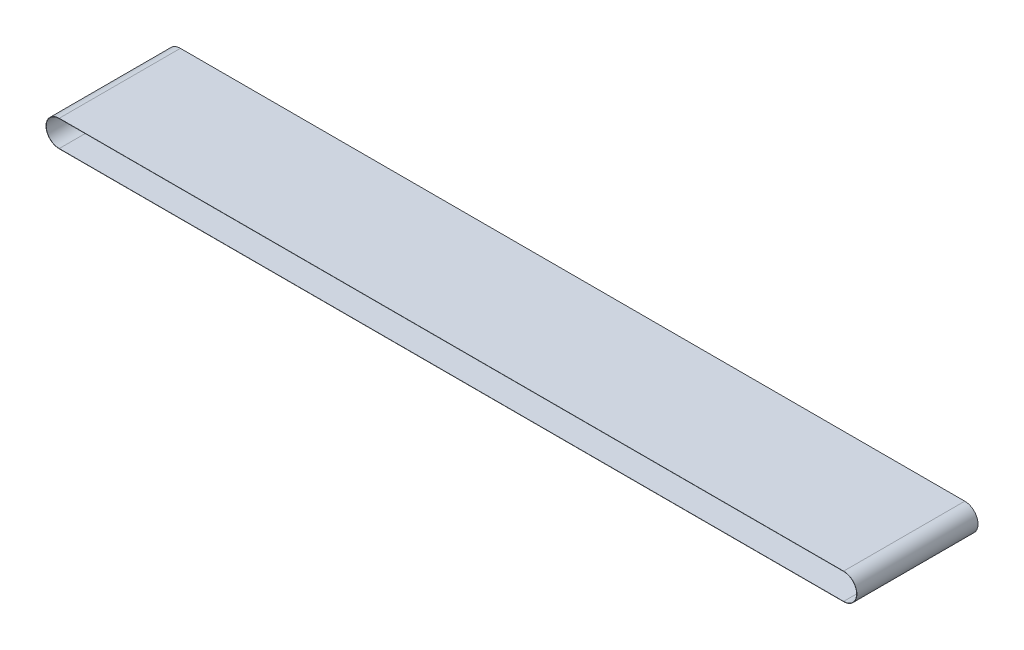
ISO-10303-21;
HEADER;
FILE_DESCRIPTION(('STEP AP214'),'2;1');
FILE_NAME('part.step','',(''),(''),'','','');
FILE_SCHEMA(('AUTOMOTIVE_DESIGN { 1 0 10303 214 1 1 1 1 }'));
ENDSEC;
DATA;
#1=APPLICATION_CONTEXT('core data for automotive mechanical design processes');
#2=APPLICATION_PROTOCOL_DEFINITION('international standard','automotive_design',2000,#1);
#3=PRODUCT_CONTEXT('',#1,'mechanical');
#4=PRODUCT('Part','Part','',(#3));
#5=PRODUCT_RELATED_PRODUCT_CATEGORY('part','',(#4));
#6=PRODUCT_DEFINITION_FORMATION('','',#4);
#7=PRODUCT_DEFINITION_CONTEXT('part definition',#1,'design');
#8=PRODUCT_DEFINITION('design','',#6,#7);
#9=PRODUCT_DEFINITION_SHAPE('','',#8);
#10=(LENGTH_UNIT() NAMED_UNIT(*) SI_UNIT(.MILLI.,.METRE.));
#11=(NAMED_UNIT(*) PLANE_ANGLE_UNIT() SI_UNIT($,.RADIAN.));
#12=(NAMED_UNIT(*) SI_UNIT($,.STERADIAN.) SOLID_ANGLE_UNIT());
#13=UNCERTAINTY_MEASURE_WITH_UNIT(LENGTH_MEASURE(1.E-05),#10,'distance_accuracy_value','');
#14=(GEOMETRIC_REPRESENTATION_CONTEXT(3) GLOBAL_UNCERTAINTY_ASSIGNED_CONTEXT((#13)) GLOBAL_UNIT_ASSIGNED_CONTEXT((#10,
#11,#12)) REPRESENTATION_CONTEXT('',''));
#15=CARTESIAN_POINT('',(0.,0.,0.));
#16=DIRECTION('',(0.,0.,1.));
#17=DIRECTION('',(1.,0.,0.));
#18=AXIS2_PLACEMENT_3D('',#15,#16,#17);
#19=CARTESIAN_POINT('',(-9873.27611144198,166.499999999996,762.5));
#20=DIRECTION('',(0.,1.,0.));
#21=DIRECTION('',(-1.,0.,0.));
#22=AXIS2_PLACEMENT_3D('',#19,#20,#21);
#23=PLANE('',#22);
#24=DIRECTION('',(1.,0.,0.));
#25=VECTOR('',#24,1.);
#26=CARTESIAN_POINT('',(-9873.27611144198,166.499999999997,-762.5));
#27=LINE('',#26,#25);
#28=CARTESIAN_POINT('',(-9873.27611144198,166.499999999997,-762.5));
#29=VERTEX_POINT('',#28);
#30=CARTESIAN_POINT('',(0.,166.499999999999,-762.5));
#31=VERTEX_POINT('',#30);
#32=EDGE_CURVE('E11',#29,#31,#27,.T.);
#33=ORIENTED_EDGE('',*,*,#32,.F.);
#34=DIRECTION('',(0.,0.,1.));
#35=VECTOR('',#34,1.);
#36=CARTESIAN_POINT('',(-9873.27611144198,166.499999999996,762.5));
#37=LINE('',#36,#35);
#38=CARTESIAN_POINT('',(-9873.27611144198,166.499999999996,762.5));
#39=VERTEX_POINT('',#38);
#40=EDGE_CURVE('E37',#29,#39,#37,.T.);
#41=ORIENTED_EDGE('',*,*,#40,.T.);
#42=DIRECTION('',(1.,0.,0.));
#43=VECTOR('',#42,1.);
#44=CARTESIAN_POINT('',(-9873.27611144198,166.499999999996,762.5));
#45=LINE('',#44,#43);
#46=CARTESIAN_POINT('',(0.,166.499999999999,762.5));
#47=VERTEX_POINT('',#46);
#48=EDGE_CURVE('E122',#39,#47,#45,.T.);
#49=ORIENTED_EDGE('',*,*,#48,.T.);
#50=DIRECTION('',(0.,0.,1.));
#51=VECTOR('',#50,1.);
#52=CARTESIAN_POINT('',(0.,166.499999999999,762.5));
#53=LINE('',#52,#51);
#54=EDGE_CURVE('E125',#31,#47,#53,.T.);
#55=ORIENTED_EDGE('',*,*,#54,.F.);
#56=EDGE_LOOP('',(#33,#41,#49,#55));
#57=FACE_BOUND('',#56,.T.);
#58=ADVANCED_FACE('F34',(#57),#23,.T.);
#59=CARTESIAN_POINT('',(-9873.27611144198,166.499999999997,-762.5));
#60=DIRECTION('',(0.,0.,-1.));
#61=DIRECTION('',(-1.,0.,0.));
#62=AXIS2_PLACEMENT_3D('',#59,#60,#61);
#63=PLANE('',#62);
#64=DIRECTION('',(1.,0.,0.));
#65=VECTOR('',#64,1.);
#66=CARTESIAN_POINT('',(-9873.27611144198,163.499999999996,-762.5));
#67=LINE('',#66,#65);
#68=CARTESIAN_POINT('',(-9873.27611144198,163.499999999996,-762.5));
#69=VERTEX_POINT('',#68);
#70=CARTESIAN_POINT('',(0.,163.499999999999,-762.5));
#71=VERTEX_POINT('',#70);
#72=EDGE_CURVE('E42',#69,#71,#67,.T.);
#73=ORIENTED_EDGE('',*,*,#72,.F.);
#74=DIRECTION('',(0.,1.,0.));
#75=VECTOR('',#74,1.);
#76=CARTESIAN_POINT('',(-9873.27611144198,166.499999999997,-762.5));
#77=LINE('',#76,#75);
#78=EDGE_CURVE('E192',#69,#29,#77,.T.);
#79=ORIENTED_EDGE('',*,*,#78,.T.);
#80=ORIENTED_EDGE('',*,*,#32,.T.);
#81=DIRECTION('',(0.,1.,0.));
#82=VECTOR('',#81,1.);
#83=CARTESIAN_POINT('',(0.,166.499999999999,-762.5));
#84=LINE('',#83,#82);
#85=EDGE_CURVE('E150',#71,#31,#84,.T.);
#86=ORIENTED_EDGE('',*,*,#85,.F.);
#87=EDGE_LOOP('',(#73,#79,#80,#86));
#88=FACE_BOUND('',#87,.T.);
#89=ADVANCED_FACE('F216',(#88),#63,.T.);
#90=CARTESIAN_POINT('',(-9873.27611144198,163.499999999996,762.5));
#91=DIRECTION('',(0.,-1.,0.));
#92=DIRECTION('',(1.,0.,0.));
#93=AXIS2_PLACEMENT_3D('',#90,#91,#92);
#94=PLANE('',#93);
#95=DIRECTION('',(1.,0.,0.));
#96=VECTOR('',#95,1.);
#97=CARTESIAN_POINT('',(-9873.27611144198,163.499999999996,762.5));
#98=LINE('',#97,#96);
#99=CARTESIAN_POINT('',(-9873.27611144198,163.499999999996,762.5));
#100=VERTEX_POINT('',#99);
#101=CARTESIAN_POINT('',(0.,163.499999999999,762.5));
#102=VERTEX_POINT('',#101);
#103=EDGE_CURVE('E131',#100,#102,#98,.T.);
#104=ORIENTED_EDGE('',*,*,#103,.F.);
#105=DIRECTION('',(0.,0.,-1.));
#106=VECTOR('',#105,1.);
#107=CARTESIAN_POINT('',(-9873.27611144198,163.499999999996,762.5));
#108=LINE('',#107,#106);
#109=EDGE_CURVE('E176',#100,#69,#108,.T.);
#110=ORIENTED_EDGE('',*,*,#109,.T.);
#111=ORIENTED_EDGE('',*,*,#72,.T.);
#112=DIRECTION('',(0.,0.,-1.));
#113=VECTOR('',#112,1.);
#114=CARTESIAN_POINT('',(0.,163.499999999999,762.5));
#115=LINE('',#114,#113);
#116=EDGE_CURVE('E154',#102,#71,#115,.T.);
#117=ORIENTED_EDGE('',*,*,#116,.F.);
#118=EDGE_LOOP('',(#104,#110,#111,#117));
#119=FACE_BOUND('',#118,.T.);
#120=ADVANCED_FACE('F221',(#119),#94,.T.);
#121=CARTESIAN_POINT('',(-9873.27611144197,-8.88178419700125E-13,0.));
#122=DIRECTION('',(0.,0.,-1.));
#123=DIRECTION('',(-1.,0.,0.));
#124=AXIS2_PLACEMENT_3D('',#121,#122,#123);
#125=CYLINDRICAL_SURFACE('',#124,166.499999999997);
#126=ORIENTED_EDGE('',*,*,#40,.F.);
#127=CARTESIAN_POINT('',(-9873.27611144197,-8.88178419700125E-13,-762.5));
#128=DIRECTION('',(0.,0.,-1.));
#129=DIRECTION('',(0.,-1.,0.));
#130=AXIS2_PLACEMENT_3D('',#127,#128,#129);
#131=CIRCLE('',#130,166.499999999997);
#132=CARTESIAN_POINT('',(-9873.27611144197,-166.500000000002,-762.5));
#133=VERTEX_POINT('',#132);
#134=EDGE_CURVE('E78',#133,#29,#131,.T.);
#135=ORIENTED_EDGE('',*,*,#134,.F.);
#136=DIRECTION('',(0.,0.,1.));
#137=VECTOR('',#136,1.);
#138=CARTESIAN_POINT('',(-9873.27611144197,-166.499999999998,762.5));
#139=LINE('',#138,#137);
#140=CARTESIAN_POINT('',(-9873.27611144197,-166.500000000002,762.5));
#141=VERTEX_POINT('',#140);
#142=EDGE_CURVE('E179',#133,#141,#139,.T.);
#143=ORIENTED_EDGE('',*,*,#142,.T.);
#144=CARTESIAN_POINT('',(-9873.27611144197,-8.88178419700125E-13,762.5));
#145=DIRECTION('',(0.,0.,-1.));
#146=DIRECTION('',(0.,-1.,0.));
#147=AXIS2_PLACEMENT_3D('',#144,#145,#146);
#148=CIRCLE('',#147,166.499999999997);
#149=EDGE_CURVE('E174',#141,#39,#148,.T.);
#150=ORIENTED_EDGE('',*,*,#149,.T.);
#151=EDGE_LOOP('',(#126,#135,#143,#150));
#152=FACE_BOUND('',#151,.T.);
#153=ADVANCED_FACE('F205',(#152),#125,.T.);
#154=CARTESIAN_POINT('',(-9873.27611144197,-166.499999999998,-762.5));
#155=DIRECTION('',(0.,0.,-1.));
#156=DIRECTION('',(-1.,0.,0.));
#157=AXIS2_PLACEMENT_3D('',#154,#155,#156);
#158=PLANE('',#157);
#159=ORIENTED_EDGE('',*,*,#134,.T.);
#160=ORIENTED_EDGE('',*,*,#78,.F.);
#161=CARTESIAN_POINT('',(-9873.27611144197,-8.88178419700125E-13,-762.5));
#162=DIRECTION('',(0.,0.,-1.));
#163=DIRECTION('',(0.,-1.,0.));
#164=AXIS2_PLACEMENT_3D('',#161,#162,#163);
#165=CIRCLE('',#164,163.499999999997);
#166=CARTESIAN_POINT('',(-9873.27611144197,-163.500000000002,-762.5));
#167=VERTEX_POINT('',#166);
#168=EDGE_CURVE('E87',#167,#69,#165,.T.);
#169=ORIENTED_EDGE('',*,*,#168,.F.);
#170=DIRECTION('',(0.,-1.,0.));
#171=VECTOR('',#170,1.);
#172=CARTESIAN_POINT('',(-9873.27611144197,-166.499999999998,-762.5));
#173=LINE('',#172,#171);
#174=EDGE_CURVE('E188',#167,#133,#173,.T.);
#175=ORIENTED_EDGE('',*,*,#174,.T.);
#176=EDGE_LOOP('',(#159,#160,#169,#175));
#177=FACE_BOUND('',#176,.T.);
#178=ADVANCED_FACE('F215',(#177),#158,.T.);
#179=CARTESIAN_POINT('',(-9873.27611144197,-8.88178419700125E-13,0.));
#180=DIRECTION('',(0.,0.,-1.));
#181=DIRECTION('',(-1.,0.,0.));
#182=AXIS2_PLACEMENT_3D('',#179,#180,#181);
#183=CYLINDRICAL_SURFACE('',#182,163.499999999997);
#184=ORIENTED_EDGE('',*,*,#168,.T.);
#185=ORIENTED_EDGE('',*,*,#109,.F.);
#186=CARTESIAN_POINT('',(-9873.27611144197,-8.88178419700125E-13,762.5));
#187=DIRECTION('',(0.,0.,-1.));
#188=DIRECTION('',(0.,-1.,0.));
#189=AXIS2_PLACEMENT_3D('',#186,#187,#188);
#190=CIRCLE('',#189,163.499999999997);
#191=CARTESIAN_POINT('',(-9873.27611144197,-163.500000000002,762.5));
#192=VERTEX_POINT('',#191);
#193=EDGE_CURVE('E95',#192,#100,#190,.T.);
#194=ORIENTED_EDGE('',*,*,#193,.F.);
#195=DIRECTION('',(0.,0.,-1.));
#196=VECTOR('',#195,1.);
#197=CARTESIAN_POINT('',(-9873.27611144197,-163.499999999998,762.5));
#198=LINE('',#197,#196);
#199=EDGE_CURVE('E168',#192,#167,#198,.T.);
#200=ORIENTED_EDGE('',*,*,#199,.T.);
#201=EDGE_LOOP('',(#184,#185,#194,#200));
#202=FACE_BOUND('',#201,.T.);
#203=ADVANCED_FACE('F222',(#202),#183,.F.);
#204=CARTESIAN_POINT('',(-9873.27611144197,-166.499999999998,762.5));
#205=DIRECTION('',(0.,0.,1.));
#206=DIRECTION('',(1.,0.,0.));
#207=AXIS2_PLACEMENT_3D('',#204,#205,#206);
#208=PLANE('',#207);
#209=ORIENTED_EDGE('',*,*,#193,.T.);
#210=DIRECTION('',(0.,-1.,0.));
#211=VECTOR('',#210,1.);
#212=CARTESIAN_POINT('',(-9873.27611144198,166.499999999996,762.5));
#213=LINE('',#212,#211);
#214=EDGE_CURVE('E172',#39,#100,#213,.T.);
#215=ORIENTED_EDGE('',*,*,#214,.F.);
#216=ORIENTED_EDGE('',*,*,#149,.F.);
#217=DIRECTION('',(0.,1.,0.));
#218=VECTOR('',#217,1.);
#219=CARTESIAN_POINT('',(-9873.27611144197,-166.499999999998,762.5));
#220=LINE('',#219,#218);
#221=EDGE_CURVE('E163',#141,#192,#220,.T.);
#222=ORIENTED_EDGE('',*,*,#221,.T.);
#223=EDGE_LOOP('',(#209,#215,#216,#222));
#224=FACE_BOUND('',#223,.T.);
#225=ADVANCED_FACE('F223',(#224),#208,.T.);
#226=CARTESIAN_POINT('',(0.,-166.499999999999,762.5));
#227=DIRECTION('',(0.,-1.,0.));
#228=DIRECTION('',(1.,0.,0.));
#229=AXIS2_PLACEMENT_3D('',#226,#227,#228);
#230=PLANE('',#229);
#231=ORIENTED_EDGE('',*,*,#142,.F.);
#232=DIRECTION('',(-1.,0.,0.));
#233=VECTOR('',#232,1.);
#234=CARTESIAN_POINT('',(0.,-166.499999999999,-762.5));
#235=LINE('',#234,#233);
#236=CARTESIAN_POINT('',(0.,-166.499999999996,-762.5));
#237=VERTEX_POINT('',#236);
#238=EDGE_CURVE('E198',#237,#133,#235,.T.);
#239=ORIENTED_EDGE('',*,*,#238,.F.);
#240=DIRECTION('',(0.,0.,1.));
#241=VECTOR('',#240,1.);
#242=CARTESIAN_POINT('',(0.,-166.499999999999,762.5));
#243=LINE('',#242,#241);
#244=CARTESIAN_POINT('',(0.,-166.499999999995,762.5));
#245=VERTEX_POINT('',#244);
#246=EDGE_CURVE('E171',#237,#245,#243,.T.);
#247=ORIENTED_EDGE('',*,*,#246,.T.);
#248=DIRECTION('',(-1.,0.,0.));
#249=VECTOR('',#248,1.);
#250=CARTESIAN_POINT('',(0.,-166.499999999999,762.5));
#251=LINE('',#250,#249);
#252=EDGE_CURVE('E166',#245,#141,#251,.T.);
#253=ORIENTED_EDGE('',*,*,#252,.T.);
#254=EDGE_LOOP('',(#231,#239,#247,#253));
#255=FACE_BOUND('',#254,.T.);
#256=ADVANCED_FACE('F210',(#255),#230,.T.);
#257=CARTESIAN_POINT('',(0.,-166.499999999999,-762.5));
#258=DIRECTION('',(0.,0.,-1.));
#259=DIRECTION('',(-1.,0.,0.));
#260=AXIS2_PLACEMENT_3D('',#257,#258,#259);
#261=PLANE('',#260);
#262=ORIENTED_EDGE('',*,*,#238,.T.);
#263=ORIENTED_EDGE('',*,*,#174,.F.);
#264=DIRECTION('',(-1.,0.,0.));
#265=VECTOR('',#264,1.);
#266=CARTESIAN_POINT('',(0.,-163.499999999999,-762.5));
#267=LINE('',#266,#265);
#268=CARTESIAN_POINT('',(0.,-163.499999999996,-762.5));
#269=VERTEX_POINT('',#268);
#270=EDGE_CURVE('E107',#269,#167,#267,.T.);
#271=ORIENTED_EDGE('',*,*,#270,.F.);
#272=DIRECTION('',(0.,-1.,0.));
#273=VECTOR('',#272,1.);
#274=CARTESIAN_POINT('',(0.,-166.499999999999,-762.5));
#275=LINE('',#274,#273);
#276=EDGE_CURVE('E185',#269,#237,#275,.T.);
#277=ORIENTED_EDGE('',*,*,#276,.T.);
#278=EDGE_LOOP('',(#262,#263,#271,#277));
#279=FACE_BOUND('',#278,.T.);
#280=ADVANCED_FACE('F214',(#279),#261,.T.);
#281=CARTESIAN_POINT('',(0.,-163.499999999999,762.5));
#282=DIRECTION('',(0.,1.,0.));
#283=DIRECTION('',(-1.,0.,0.));
#284=AXIS2_PLACEMENT_3D('',#281,#282,#283);
#285=PLANE('',#284);
#286=ORIENTED_EDGE('',*,*,#270,.T.);
#287=ORIENTED_EDGE('',*,*,#199,.F.);
#288=DIRECTION('',(-1.,0.,0.));
#289=VECTOR('',#288,1.);
#290=CARTESIAN_POINT('',(0.,-163.499999999999,762.5));
#291=LINE('',#290,#289);
#292=CARTESIAN_POINT('',(0.,-163.499999999996,762.5));
#293=VERTEX_POINT('',#292);
#294=EDGE_CURVE('E113',#293,#192,#291,.T.);
#295=ORIENTED_EDGE('',*,*,#294,.F.);
#296=DIRECTION('',(0.,0.,-1.));
#297=VECTOR('',#296,1.);
#298=CARTESIAN_POINT('',(0.,-163.499999999999,762.5));
#299=LINE('',#298,#297);
#300=EDGE_CURVE('E161',#293,#269,#299,.T.);
#301=ORIENTED_EDGE('',*,*,#300,.T.);
#302=EDGE_LOOP('',(#286,#287,#295,#301));
#303=FACE_BOUND('',#302,.T.);
#304=ADVANCED_FACE('F276',(#303),#285,.T.);
#305=CARTESIAN_POINT('',(0.,-166.499999999999,762.5));
#306=DIRECTION('',(0.,0.,1.));
#307=DIRECTION('',(1.,0.,0.));
#308=AXIS2_PLACEMENT_3D('',#305,#306,#307);
#309=PLANE('',#308);
#310=ORIENTED_EDGE('',*,*,#294,.T.);
#311=ORIENTED_EDGE('',*,*,#221,.F.);
#312=ORIENTED_EDGE('',*,*,#252,.F.);
#313=DIRECTION('',(0.,1.,0.));
#314=VECTOR('',#313,1.);
#315=CARTESIAN_POINT('',(0.,-166.499999999999,762.5));
#316=LINE('',#315,#314);
#317=EDGE_CURVE('E142',#245,#293,#316,.T.);
#318=ORIENTED_EDGE('',*,*,#317,.T.);
#319=EDGE_LOOP('',(#310,#311,#312,#318));
#320=FACE_BOUND('',#319,.T.);
#321=ADVANCED_FACE('F208',(#320),#309,.T.);
#322=CARTESIAN_POINT('',(5.32907051820075E-12,1.77635683940025E-12,0.));
#323=DIRECTION('',(0.,0.,-1.));
#324=DIRECTION('',(-1.,0.,0.));
#325=AXIS2_PLACEMENT_3D('',#322,#323,#324);
#326=CYLINDRICAL_SURFACE('',#325,166.499999999997);
#327=ORIENTED_EDGE('',*,*,#246,.F.);
#328=CARTESIAN_POINT('',(5.32907051820075E-12,1.77635683940025E-12,-762.5));
#329=DIRECTION('',(0.,0.,-1.));
#330=DIRECTION('',(0.,1.,0.));
#331=AXIS2_PLACEMENT_3D('',#328,#329,#330);
#332=CIRCLE('',#331,166.499999999997);
#333=EDGE_CURVE('E149',#31,#237,#332,.T.);
#334=ORIENTED_EDGE('',*,*,#333,.F.);
#335=ORIENTED_EDGE('',*,*,#54,.T.);
#336=CARTESIAN_POINT('',(5.32907051820075E-12,1.77635683940025E-12,762.5));
#337=DIRECTION('',(0.,0.,-1.));
#338=DIRECTION('',(0.,1.,0.));
#339=AXIS2_PLACEMENT_3D('',#336,#337,#338);
#340=CIRCLE('',#339,166.499999999997);
#341=EDGE_CURVE('E137',#47,#245,#340,.T.);
#342=ORIENTED_EDGE('',*,*,#341,.T.);
#343=EDGE_LOOP('',(#327,#334,#335,#342));
#344=FACE_BOUND('',#343,.T.);
#345=ADVANCED_FACE('F147',(#344),#326,.T.);
#346=CARTESIAN_POINT('',(0.,166.499999999999,-762.5));
#347=DIRECTION('',(0.,0.,-1.));
#348=DIRECTION('',(-1.,0.,0.));
#349=AXIS2_PLACEMENT_3D('',#346,#347,#348);
#350=PLANE('',#349);
#351=ORIENTED_EDGE('',*,*,#333,.T.);
#352=ORIENTED_EDGE('',*,*,#276,.F.);
#353=CARTESIAN_POINT('',(5.32907051820075E-12,1.77635683940025E-12,-762.5));
#354=DIRECTION('',(0.,0.,-1.));
#355=DIRECTION('',(0.,1.,0.));
#356=AXIS2_PLACEMENT_3D('',#353,#354,#355);
#357=CIRCLE('',#356,163.499999999997);
#358=EDGE_CURVE('E182',#71,#269,#357,.T.);
#359=ORIENTED_EDGE('',*,*,#358,.F.);
#360=ORIENTED_EDGE('',*,*,#85,.T.);
#361=EDGE_LOOP('',(#351,#352,#359,#360));
#362=FACE_BOUND('',#361,.T.);
#363=ADVANCED_FACE('F212',(#362),#350,.T.);
#364=CARTESIAN_POINT('',(5.32907051820075E-12,1.77635683940025E-12,0.));
#365=DIRECTION('',(0.,0.,-1.));
#366=DIRECTION('',(-1.,0.,0.));
#367=AXIS2_PLACEMENT_3D('',#364,#365,#366);
#368=CYLINDRICAL_SURFACE('',#367,163.499999999997);
#369=ORIENTED_EDGE('',*,*,#358,.T.);
#370=ORIENTED_EDGE('',*,*,#300,.F.);
#371=CARTESIAN_POINT('',(5.32907051820075E-12,1.77635683940025E-12,762.5));
#372=DIRECTION('',(0.,0.,-1.));
#373=DIRECTION('',(0.,1.,0.));
#374=AXIS2_PLACEMENT_3D('',#371,#372,#373);
#375=CIRCLE('',#374,163.499999999997);
#376=EDGE_CURVE('E160',#102,#293,#375,.T.);
#377=ORIENTED_EDGE('',*,*,#376,.F.);
#378=ORIENTED_EDGE('',*,*,#116,.T.);
#379=EDGE_LOOP('',(#369,#370,#377,#378));
#380=FACE_BOUND('',#379,.T.);
#381=ADVANCED_FACE('F219',(#380),#368,.F.);
#382=CARTESIAN_POINT('',(0.,166.499999999999,762.5));
#383=DIRECTION('',(0.,0.,1.));
#384=DIRECTION('',(1.,0.,0.));
#385=AXIS2_PLACEMENT_3D('',#382,#383,#384);
#386=PLANE('',#385);
#387=ORIENTED_EDGE('',*,*,#376,.T.);
#388=ORIENTED_EDGE('',*,*,#317,.F.);
#389=ORIENTED_EDGE('',*,*,#341,.F.);
#390=DIRECTION('',(0.,-1.,0.));
#391=VECTOR('',#390,1.);
#392=CARTESIAN_POINT('',(0.,166.499999999999,762.5));
#393=LINE('',#392,#391);
#394=EDGE_CURVE('E140',#47,#102,#393,.T.);
#395=ORIENTED_EDGE('',*,*,#394,.T.);
#396=EDGE_LOOP('',(#387,#388,#389,#395));
#397=FACE_BOUND('',#396,.T.);
#398=ADVANCED_FACE('F139',(#397),#386,.T.);
#399=CARTESIAN_POINT('',(-9873.27611144198,166.499999999996,762.5));
#400=DIRECTION('',(0.,0.,1.));
#401=DIRECTION('',(1.,0.,0.));
#402=AXIS2_PLACEMENT_3D('',#399,#400,#401);
#403=PLANE('',#402);
#404=ORIENTED_EDGE('',*,*,#214,.T.);
#405=ORIENTED_EDGE('',*,*,#103,.T.);
#406=ORIENTED_EDGE('',*,*,#394,.F.);
#407=ORIENTED_EDGE('',*,*,#48,.F.);
#408=EDGE_LOOP('',(#404,#405,#406,#407));
#409=FACE_BOUND('',#408,.T.);
#410=ADVANCED_FACE('F152',(#409),#403,.T.);
#411=CLOSED_SHELL('',(#58,#89,#120,#153,#178,#203,#225,#256,#280,#304,#321,#345,#363,#381,#398,#410));
#412=MANIFOLD_SOLID_BREP('B2',#411);
#413=ADVANCED_BREP_SHAPE_REPRESENTATION('',(#18,#412),#14);
#414=SHAPE_DEFINITION_REPRESENTATION(#9,#413);
ENDSEC;
END-ISO-10303-21;
